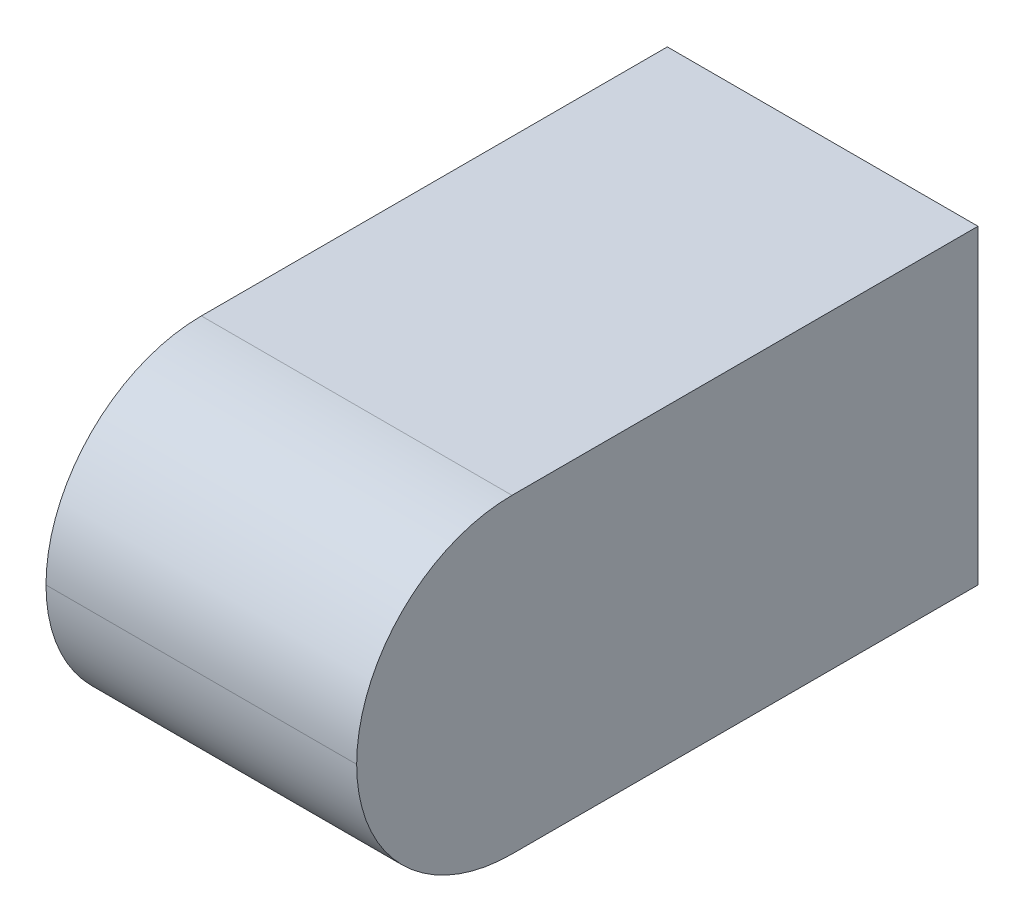
ISO-10303-21;
HEADER;
FILE_DESCRIPTION(('STEP AP214'),'2;1');
FILE_NAME('part.step','',(''),(''),'','','');
FILE_SCHEMA(('AUTOMOTIVE_DESIGN { 1 0 10303 214 1 1 1 1 }'));
ENDSEC;
DATA;
#1=APPLICATION_CONTEXT('core data for automotive mechanical design processes');
#2=APPLICATION_PROTOCOL_DEFINITION('international standard','automotive_design',2000,#1);
#3=PRODUCT_CONTEXT('',#1,'mechanical');
#4=PRODUCT('Part','Part','',(#3));
#5=PRODUCT_RELATED_PRODUCT_CATEGORY('part','',(#4));
#6=PRODUCT_DEFINITION_FORMATION('','',#4);
#7=PRODUCT_DEFINITION_CONTEXT('part definition',#1,'design');
#8=PRODUCT_DEFINITION('design','',#6,#7);
#9=PRODUCT_DEFINITION_SHAPE('','',#8);
#10=(LENGTH_UNIT() NAMED_UNIT(*) SI_UNIT(.MILLI.,.METRE.));
#11=(NAMED_UNIT(*) PLANE_ANGLE_UNIT() SI_UNIT($,.RADIAN.));
#12=(NAMED_UNIT(*) SI_UNIT($,.STERADIAN.) SOLID_ANGLE_UNIT());
#13=UNCERTAINTY_MEASURE_WITH_UNIT(LENGTH_MEASURE(1.E-05),#10,'distance_accuracy_value','');
#14=(GEOMETRIC_REPRESENTATION_CONTEXT(3) GLOBAL_UNCERTAINTY_ASSIGNED_CONTEXT((#13)) GLOBAL_UNIT_ASSIGNED_CONTEXT((#10,
#11,#12)) REPRESENTATION_CONTEXT('',''));
#15=CARTESIAN_POINT('',(0.,0.,0.));
#16=DIRECTION('',(0.,0.,1.));
#17=DIRECTION('',(1.,0.,0.));
#18=AXIS2_PLACEMENT_3D('',#15,#16,#17);
#19=CARTESIAN_POINT('',(0.,0.,30.));
#20=DIRECTION('',(0.,0.,-1.));
#21=DIRECTION('',(-1.,0.,0.));
#22=AXIS2_PLACEMENT_3D('',#19,#20,#21);
#23=CYLINDRICAL_SURFACE('',#22,5.5);
#24=CARTESIAN_POINT('',(0.,0.,0.));
#25=DIRECTION('',(0.,0.,1.));
#26=DIRECTION('',(1.,0.,0.));
#27=AXIS2_PLACEMENT_3D('',#24,#25,#26);
#28=CIRCLE('',#27,5.5);
#29=CARTESIAN_POINT('',(5.5,0.,0.));
#30=VERTEX_POINT('',#29);
#31=EDGE_CURVE('E104',#30,#30,#28,.T.);
#32=ORIENTED_EDGE('',*,*,#31,.F.);
#33=EDGE_LOOP('',(#32));
#34=FACE_BOUND('',#33,.T.);
#35=CARTESIAN_POINT('',(0.,0.,10.));
#36=DIRECTION('',(0.,0.,1.));
#37=DIRECTION('',(1.,0.,0.));
#38=AXIS2_PLACEMENT_3D('',#35,#36,#37);
#39=CIRCLE('',#38,5.5);
#40=CARTESIAN_POINT('',(5.5,0.,10.));
#41=VERTEX_POINT('',#40);
#42=EDGE_CURVE('E107',#41,#41,#39,.T.);
#43=ORIENTED_EDGE('',*,*,#42,.T.);
#44=EDGE_LOOP('',(#43));
#45=FACE_BOUND('',#44,.T.);
#46=ADVANCED_FACE('F35',(#34,#45),#23,.F.);
#47=CARTESIAN_POINT('',(0.,0.,0.));
#48=DIRECTION('',(0.,0.,-1.));
#49=DIRECTION('',(-1.,0.,0.));
#50=AXIS2_PLACEMENT_3D('',#47,#48,#49);
#51=PLANE('',#50);
#52=DIRECTION('',(0.,1.,0.));
#53=VECTOR('',#52,1.);
#54=CARTESIAN_POINT('',(7.5,-7.5,0.));
#55=LINE('',#54,#53);
#56=CARTESIAN_POINT('',(7.5,-7.5,0.));
#57=VERTEX_POINT('',#56);
#58=CARTESIAN_POINT('',(7.5,7.5,0.));
#59=VERTEX_POINT('',#58);
#60=EDGE_CURVE('E96',#57,#59,#55,.T.);
#61=ORIENTED_EDGE('',*,*,#60,.F.);
#62=DIRECTION('',(1.,0.,0.));
#63=VECTOR('',#62,1.);
#64=CARTESIAN_POINT('',(-7.5,-7.5,0.));
#65=LINE('',#64,#63);
#66=CARTESIAN_POINT('',(-7.5,-7.5,0.));
#67=VERTEX_POINT('',#66);
#68=EDGE_CURVE('E111',#67,#57,#65,.T.);
#69=ORIENTED_EDGE('',*,*,#68,.F.);
#70=DIRECTION('',(0.,-1.,0.));
#71=VECTOR('',#70,1.);
#72=CARTESIAN_POINT('',(-7.5,-7.5,0.));
#73=LINE('',#72,#71);
#74=CARTESIAN_POINT('',(-7.5,7.5,0.));
#75=VERTEX_POINT('',#74);
#76=EDGE_CURVE('E98',#75,#67,#73,.T.);
#77=ORIENTED_EDGE('',*,*,#76,.F.);
#78=DIRECTION('',(-1.,0.,0.));
#79=VECTOR('',#78,1.);
#80=CARTESIAN_POINT('',(-7.5,7.5,0.));
#81=LINE('',#80,#79);
#82=EDGE_CURVE('E82',#59,#75,#81,.T.);
#83=ORIENTED_EDGE('',*,*,#82,.F.);
#84=EDGE_LOOP('',(#61,#69,#77,#83));
#85=FACE_BOUND('',#84,.T.);
#86=ORIENTED_EDGE('',*,*,#31,.T.);
#87=EDGE_LOOP('',(#86));
#88=FACE_BOUND('',#87,.T.);
#89=ADVANCED_FACE('F93',(#85,#88),#51,.T.);
#90=CARTESIAN_POINT('',(7.5,-7.5,30.));
#91=DIRECTION('',(-1.,0.,0.));
#92=DIRECTION('',(0.,0.,1.));
#93=AXIS2_PLACEMENT_3D('',#90,#91,#92);
#94=PLANE('',#93);
#95=CARTESIAN_POINT('',(7.5,0.,22.5));
#96=DIRECTION('',(-1.,0.,0.));
#97=DIRECTION('',(0.,0.,1.));
#98=AXIS2_PLACEMENT_3D('',#95,#96,#97);
#99=CIRCLE('',#98,7.5);
#100=CARTESIAN_POINT('',(7.5,7.5,22.5));
#101=VERTEX_POINT('',#100);
#102=CARTESIAN_POINT('',(7.5,0.,30.));
#103=VERTEX_POINT('',#102);
#104=EDGE_CURVE('E88',#101,#103,#99,.F.);
#105=ORIENTED_EDGE('',*,*,#104,.T.);
#106=CARTESIAN_POINT('',(7.5,0.,22.5));
#107=DIRECTION('',(-1.,0.,0.));
#108=DIRECTION('',(0.,0.,1.));
#109=AXIS2_PLACEMENT_3D('',#106,#107,#108);
#110=CIRCLE('',#109,7.5);
#111=CARTESIAN_POINT('',(7.5,-7.5,22.5));
#112=VERTEX_POINT('',#111);
#113=EDGE_CURVE('E120',#103,#112,#110,.F.);
#114=ORIENTED_EDGE('',*,*,#113,.T.);
#115=DIRECTION('',(0.,0.,-1.));
#116=VECTOR('',#115,1.);
#117=CARTESIAN_POINT('',(7.5,-7.5,30.));
#118=LINE('',#117,#116);
#119=EDGE_CURVE('E102',#112,#57,#118,.T.);
#120=ORIENTED_EDGE('',*,*,#119,.T.);
#121=ORIENTED_EDGE('',*,*,#60,.T.);
#122=DIRECTION('',(0.,0.,-1.));
#123=VECTOR('',#122,1.);
#124=CARTESIAN_POINT('',(7.5,7.5,30.));
#125=LINE('',#124,#123);
#126=EDGE_CURVE('E79',#101,#59,#125,.T.);
#127=ORIENTED_EDGE('',*,*,#126,.F.);
#128=EDGE_LOOP('',(#105,#114,#120,#121,#127));
#129=FACE_BOUND('',#128,.T.);
#130=ADVANCED_FACE('F100',(#129),#94,.F.);
#131=CARTESIAN_POINT('',(-7.5,7.5,30.));
#132=DIRECTION('',(0.,-1.,0.));
#133=DIRECTION('',(0.,0.,-1.));
#134=AXIS2_PLACEMENT_3D('',#131,#132,#133);
#135=PLANE('',#134);
#136=DIRECTION('',(0.,0.,-1.));
#137=VECTOR('',#136,1.);
#138=CARTESIAN_POINT('',(-7.5,7.5,30.));
#139=LINE('',#138,#137);
#140=CARTESIAN_POINT('',(-7.5,7.5,22.5));
#141=VERTEX_POINT('',#140);
#142=EDGE_CURVE('E89',#141,#75,#139,.T.);
#143=ORIENTED_EDGE('',*,*,#142,.F.);
#144=DIRECTION('',(-1.,0.,0.));
#145=VECTOR('',#144,1.);
#146=CARTESIAN_POINT('',(-7.5,7.5,22.5));
#147=LINE('',#146,#145);
#148=EDGE_CURVE('E11',#141,#101,#147,.F.);
#149=ORIENTED_EDGE('',*,*,#148,.T.);
#150=ORIENTED_EDGE('',*,*,#126,.T.);
#151=ORIENTED_EDGE('',*,*,#82,.T.);
#152=EDGE_LOOP('',(#143,#149,#150,#151));
#153=FACE_BOUND('',#152,.T.);
#154=ADVANCED_FACE('F81',(#153),#135,.F.);
#155=CARTESIAN_POINT('',(-7.5,-7.5,30.));
#156=DIRECTION('',(1.,0.,0.));
#157=DIRECTION('',(0.,0.,-1.));
#158=AXIS2_PLACEMENT_3D('',#155,#156,#157);
#159=PLANE('',#158);
#160=DIRECTION('',(0.,0.,-1.));
#161=VECTOR('',#160,1.);
#162=CARTESIAN_POINT('',(-7.5,-7.5,30.));
#163=LINE('',#162,#161);
#164=CARTESIAN_POINT('',(-7.5,-7.5,22.5));
#165=VERTEX_POINT('',#164);
#166=EDGE_CURVE('E114',#165,#67,#163,.T.);
#167=ORIENTED_EDGE('',*,*,#166,.F.);
#168=CARTESIAN_POINT('',(-7.5,0.,22.5));
#169=DIRECTION('',(1.,0.,0.));
#170=DIRECTION('',(0.,0.,-1.));
#171=AXIS2_PLACEMENT_3D('',#168,#169,#170);
#172=CIRCLE('',#171,7.5);
#173=CARTESIAN_POINT('',(-7.5,0.,30.));
#174=VERTEX_POINT('',#173);
#175=EDGE_CURVE('E44',#165,#174,#172,.F.);
#176=ORIENTED_EDGE('',*,*,#175,.T.);
#177=CARTESIAN_POINT('',(-7.5,0.,22.5));
#178=DIRECTION('',(1.,0.,0.));
#179=DIRECTION('',(0.,0.,-1.));
#180=AXIS2_PLACEMENT_3D('',#177,#178,#179);
#181=CIRCLE('',#180,7.5);
#182=EDGE_CURVE('E54',#174,#141,#181,.F.);
#183=ORIENTED_EDGE('',*,*,#182,.T.);
#184=ORIENTED_EDGE('',*,*,#142,.T.);
#185=ORIENTED_EDGE('',*,*,#76,.T.);
#186=EDGE_LOOP('',(#167,#176,#183,#184,#185));
#187=FACE_BOUND('',#186,.T.);
#188=ADVANCED_FACE('F131',(#187),#159,.F.);
#189=CARTESIAN_POINT('',(-7.5,-7.5,30.));
#190=DIRECTION('',(0.,1.,0.));
#191=DIRECTION('',(0.,0.,1.));
#192=AXIS2_PLACEMENT_3D('',#189,#190,#191);
#193=PLANE('',#192);
#194=ORIENTED_EDGE('',*,*,#119,.F.);
#195=DIRECTION('',(1.,0.,0.));
#196=VECTOR('',#195,1.);
#197=CARTESIAN_POINT('',(-7.5,-7.5,22.5));
#198=LINE('',#197,#196);
#199=EDGE_CURVE('E122',#112,#165,#198,.F.);
#200=ORIENTED_EDGE('',*,*,#199,.T.);
#201=ORIENTED_EDGE('',*,*,#166,.T.);
#202=ORIENTED_EDGE('',*,*,#68,.T.);
#203=EDGE_LOOP('',(#194,#200,#201,#202));
#204=FACE_BOUND('',#203,.T.);
#205=ADVANCED_FACE('F128',(#204),#193,.F.);
#206=CARTESIAN_POINT('',(0.,0.,10.));
#207=DIRECTION('',(0.,0.,1.));
#208=DIRECTION('',(1.,0.,0.));
#209=AXIS2_PLACEMENT_3D('',#206,#207,#208);
#210=PLANE('',#209);
#211=ORIENTED_EDGE('',*,*,#42,.F.);
#212=EDGE_LOOP('',(#211));
#213=FACE_BOUND('',#212,.T.);
#214=ADVANCED_FACE('F140',(#213),#210,.F.);
#215=CARTESIAN_POINT('',(0.,0.,22.5));
#216=DIRECTION('',(-1.,0.,0.));
#217=DIRECTION('',(0.,0.,1.));
#218=AXIS2_PLACEMENT_3D('',#215,#216,#217);
#219=CYLINDRICAL_SURFACE('',#218,7.5);
#220=ORIENTED_EDGE('',*,*,#148,.F.);
#221=ORIENTED_EDGE('',*,*,#182,.F.);
#222=DIRECTION('',(-1.,0.,0.));
#223=VECTOR('',#222,1.);
#224=CARTESIAN_POINT('',(0.,0.,30.));
#225=LINE('',#224,#223);
#226=EDGE_CURVE('E39',#103,#174,#225,.T.);
#227=ORIENTED_EDGE('',*,*,#226,.F.);
#228=ORIENTED_EDGE('',*,*,#104,.F.);
#229=EDGE_LOOP('',(#220,#221,#227,#228));
#230=FACE_BOUND('',#229,.T.);
#231=ADVANCED_FACE('F37',(#230),#219,.T.);
#232=CARTESIAN_POINT('',(0.,0.,22.5));
#233=DIRECTION('',(1.,0.,0.));
#234=DIRECTION('',(0.,0.,-1.));
#235=AXIS2_PLACEMENT_3D('',#232,#233,#234);
#236=CYLINDRICAL_SURFACE('',#235,7.5);
#237=ORIENTED_EDGE('',*,*,#175,.F.);
#238=ORIENTED_EDGE('',*,*,#199,.F.);
#239=ORIENTED_EDGE('',*,*,#113,.F.);
#240=ORIENTED_EDGE('',*,*,#226,.T.);
#241=EDGE_LOOP('',(#237,#238,#239,#240));
#242=FACE_BOUND('',#241,.T.);
#243=ADVANCED_FACE('F135',(#242),#236,.T.);
#244=CLOSED_SHELL('',(#46,#89,#130,#154,#188,#205,#214,#231,#243));
#245=MANIFOLD_SOLID_BREP('B2',#244);
#246=ADVANCED_BREP_SHAPE_REPRESENTATION('',(#18,#245),#14);
#247=SHAPE_DEFINITION_REPRESENTATION(#9,#246);
ENDSEC;
END-ISO-10303-21;
